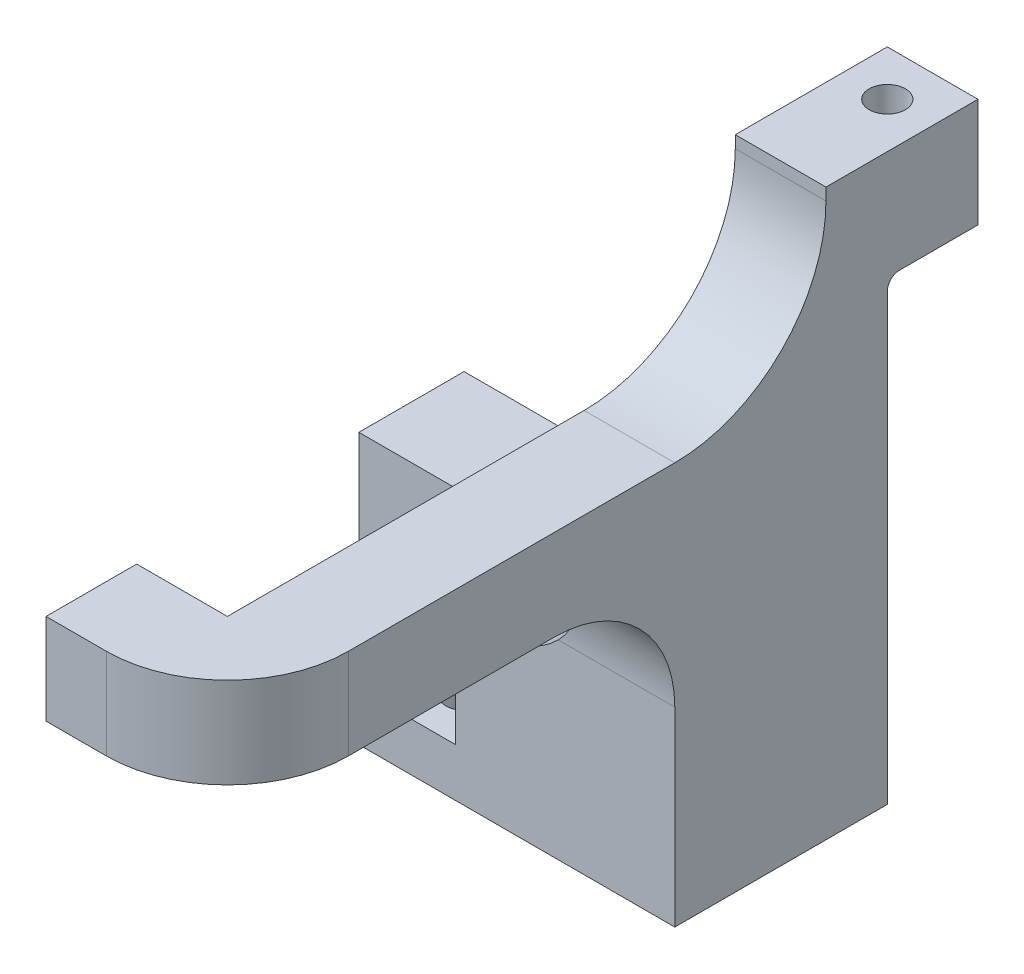
ISO-10303-21;
HEADER;
FILE_DESCRIPTION(('STEP AP214'),'2;1');
FILE_NAME('part.step','',(''),(''),'','','');
FILE_SCHEMA(('AUTOMOTIVE_DESIGN { 1 0 10303 214 1 1 1 1 }'));
ENDSEC;
DATA;
#1=APPLICATION_CONTEXT('core data for automotive mechanical design processes');
#2=APPLICATION_PROTOCOL_DEFINITION('international standard','automotive_design',2000,#1);
#3=PRODUCT_CONTEXT('',#1,'mechanical');
#4=PRODUCT('Part','Part','',(#3));
#5=PRODUCT_RELATED_PRODUCT_CATEGORY('part','',(#4));
#6=PRODUCT_DEFINITION_FORMATION('','',#4);
#7=PRODUCT_DEFINITION_CONTEXT('part definition',#1,'design');
#8=PRODUCT_DEFINITION('design','',#6,#7);
#9=PRODUCT_DEFINITION_SHAPE('','',#8);
#10=(LENGTH_UNIT() NAMED_UNIT(*) SI_UNIT(.MILLI.,.METRE.));
#11=(NAMED_UNIT(*) PLANE_ANGLE_UNIT() SI_UNIT($,.RADIAN.));
#12=(NAMED_UNIT(*) SI_UNIT($,.STERADIAN.) SOLID_ANGLE_UNIT());
#13=UNCERTAINTY_MEASURE_WITH_UNIT(LENGTH_MEASURE(1.E-05),#10,'distance_accuracy_value','');
#14=(GEOMETRIC_REPRESENTATION_CONTEXT(3) GLOBAL_UNCERTAINTY_ASSIGNED_CONTEXT((#13)) GLOBAL_UNIT_ASSIGNED_CONTEXT((#10,
#11,#12)) REPRESENTATION_CONTEXT('',''));
#15=CARTESIAN_POINT('',(0.,0.,0.));
#16=DIRECTION('',(0.,0.,1.));
#17=DIRECTION('',(1.,0.,0.));
#18=AXIS2_PLACEMENT_3D('',#15,#16,#17);
#19=CARTESIAN_POINT('',(-72.925,40.,80.1975398981366));
#20=DIRECTION('',(0.,0.,-1.));
#21=DIRECTION('',(1.,0.,0.));
#22=AXIS2_PLACEMENT_3D('',#19,#20,#21);
#23=CYLINDRICAL_SURFACE('',#22,7.5);
#24=CARTESIAN_POINT('',(-65.425,40.,64.1139777347254));
#25=CARTESIAN_POINT('',(-65.4249772438871,39.8445221092474,64.0180331681623));
#26=CARTESIAN_POINT('',(-65.4298346400299,39.686339067759,63.9263783075882));
#27=CARTESIAN_POINT('',(-65.4501528101208,39.3656502932931,63.7520680027181));
#28=CARTESIAN_POINT('',(-65.4656192459043,39.2031422967066,63.6694173911189));
#29=CARTESIAN_POINT('',(-65.5079324331207,38.8755858491255,63.513888847099));
#30=CARTESIAN_POINT('',(-65.5347425315859,38.7105472158723,63.440980425979));
#31=CARTESIAN_POINT('',(-65.600351000794,38.3788638985895,63.3049432948971));
#32=CARTESIAN_POINT('',(-65.6391467735014,38.2122195701897,63.2418124699744));
#33=CARTESIAN_POINT('',(-65.7293371098939,37.8780884322385,63.1251835039027));
#34=CARTESIAN_POINT('',(-65.7807860976065,37.710601128866,63.0717287530682));
#35=CARTESIAN_POINT('',(-65.8963667348753,37.3771281979921,62.9746965544279));
#36=CARTESIAN_POINT('',(-65.960499551139,37.2111427101033,62.9311200160502));
#37=CARTESIAN_POINT('',(-66.1013869419035,36.8822570897864,62.8535087240611));
#38=CARTESIAN_POINT('',(-66.1781460783117,36.7193580963232,62.8194774312266));
#39=CARTESIAN_POINT('',(-66.3439519124394,36.398271088903,62.7604244734835));
#40=CARTESIAN_POINT('',(-66.4329976393504,36.2400827039432,62.7354020973107));
#41=CARTESIAN_POINT('',(-66.6194094708557,35.9354901653982,62.6943723268248));
#42=CARTESIAN_POINT('',(-66.7163532082868,35.7888666331716,62.6780692012634));
#43=CARTESIAN_POINT('',(-66.9206277090854,35.5023926490622,62.6523075545515));
#44=CARTESIAN_POINT('',(-67.0279597461105,35.3625430308571,62.6428498738952));
#45=CARTESIAN_POINT('',(-67.2524721214189,35.0904630322989,62.6298685426952));
#46=CARTESIAN_POINT('',(-67.3696627813558,34.9582408879846,62.6263511947394));
#47=CARTESIAN_POINT('',(-67.6130510302732,34.7024123799341,62.6242940516118));
#48=CARTESIAN_POINT('',(-67.7392451816666,34.5788027631369,62.6257523665544));
#49=CARTESIAN_POINT('',(-67.8696144573129,34.4598666970198,62.6292097527758));
#50=B_SPLINE_CURVE_WITH_KNOTS('',3,(#24,#25,#26,#27,#28,#29,#30,#31,#32,#33,#34,#35,#36,#37,#38,
#39,#40,#41,#42,#43,#44,#45,#46,#47,#48,#49),.UNSPECIFIED.,.F.,.F.,(4,2,2,2,2,2,2,2,2,2,2,2,4),
(0.,0.548035113739717,1.09636293080322,1.64293239308,2.18938346304048,2.73822734665108,
3.28712173854301,3.83621488411844,4.38526466865447,4.91427257243661,5.44334541759769,
5.9729792478444,6.50241193184122),.UNSPECIFIED.);
#51=CARTESIAN_POINT('',(-67.5689286785929,34.75,62.625));
#52=VERTEX_POINT('',#51);
#53=CARTESIAN_POINT('',(-65.425,40.,64.1139777347254));
#54=VERTEX_POINT('',#53);
#55=EDGE_CURVE('E412',#52,#54,#50,.F.);
#56=ORIENTED_EDGE('',*,*,#55,.T.);
#57=DIRECTION('',(0.,0.,-1.));
#58=VECTOR('',#57,1.);
#59=CARTESIAN_POINT('',(-65.425,40.,80.1975398981366));
#60=LINE('',#59,#58);
#61=CARTESIAN_POINT('',(-65.425,40.,45.0524601018634));
#62=VERTEX_POINT('',#61);
#63=EDGE_CURVE('E406',#54,#62,#60,.T.);
#64=ORIENTED_EDGE('',*,*,#63,.T.);
#65=CARTESIAN_POINT('',(-72.925,40.,45.0524601018634));
#66=DIRECTION('',(0.,0.,1.));
#67=DIRECTION('',(1.,0.,0.));
#68=AXIS2_PLACEMENT_3D('',#65,#66,#67);
#69=CIRCLE('',#68,7.5);
#70=CARTESIAN_POINT('',(-72.925,32.5,45.0524601018634));
#71=VERTEX_POINT('',#70);
#72=EDGE_CURVE('E11',#71,#62,#69,.T.);
#73=ORIENTED_EDGE('',*,*,#72,.F.);
#74=DIRECTION('',(0.,0.,-1.));
#75=VECTOR('',#74,1.);
#76=CARTESIAN_POINT('',(-72.925,32.5,58.7524601018634));
#77=LINE('',#76,#75);
#78=CARTESIAN_POINT('',(-72.925,32.5,62.625));
#79=VERTEX_POINT('',#78);
#80=EDGE_CURVE('E409',#71,#79,#77,.F.);
#81=ORIENTED_EDGE('',*,*,#80,.T.);
#82=CARTESIAN_POINT('',(-72.925,40.,62.625));
#83=DIRECTION('',(0.,0.,1.));
#84=DIRECTION('',(1.,0.,0.));
#85=AXIS2_PLACEMENT_3D('',#82,#83,#84);
#86=CIRCLE('',#85,7.5);
#87=EDGE_CURVE('E45',#52,#79,#86,.F.);
#88=ORIENTED_EDGE('',*,*,#87,.F.);
#89=EDGE_LOOP('',(#56,#64,#73,#81,#88));
#90=FACE_BOUND('',#89,.T.);
#91=ADVANCED_FACE('F37',(#90),#23,.F.);
#92=CARTESIAN_POINT('',(0.,55.75,44.0524601018634));
#93=DIRECTION('',(-1.,0.,0.));
#94=DIRECTION('',(0.,0.,-1.));
#95=AXIS2_PLACEMENT_3D('',#92,#93,#94);
#96=CYLINDRICAL_SURFACE('',#95,1.);
#97=DIRECTION('',(1.,0.,0.));
#98=VECTOR('',#97,1.);
#99=CARTESIAN_POINT('',(0.,56.75,44.0524601018634));
#100=LINE('',#99,#98);
#101=CARTESIAN_POINT('',(-65.425,56.75,44.0524601018634));
#102=VERTEX_POINT('',#101);
#103=CARTESIAN_POINT('',(-57.925,56.75,44.0524601018634));
#104=VERTEX_POINT('',#103);
#105=EDGE_CURVE('E397',#102,#104,#100,.T.);
#106=ORIENTED_EDGE('',*,*,#105,.T.);
#107=CARTESIAN_POINT('',(-57.925,55.75,44.0524601018634));
#108=DIRECTION('',(1.,0.,0.));
#109=DIRECTION('',(0.,0.,-1.));
#110=AXIS2_PLACEMENT_3D('',#107,#108,#109);
#111=CIRCLE('',#110,1.);
#112=CARTESIAN_POINT('',(-57.925,55.75,45.0524601018634));
#113=VERTEX_POINT('',#112);
#114=EDGE_CURVE('E230',#113,#104,#111,.F.);
#115=ORIENTED_EDGE('',*,*,#114,.F.);
#116=DIRECTION('',(1.,0.,0.));
#117=VECTOR('',#116,1.);
#118=CARTESIAN_POINT('',(0.,55.75,45.0524601018634));
#119=LINE('',#118,#117);
#120=CARTESIAN_POINT('',(-65.425,55.75,45.0524601018634));
#121=VERTEX_POINT('',#120);
#122=EDGE_CURVE('E399',#113,#121,#119,.F.);
#123=ORIENTED_EDGE('',*,*,#122,.T.);
#124=CARTESIAN_POINT('',(-65.425,55.75,44.0524601018634));
#125=DIRECTION('',(1.,0.,0.));
#126=DIRECTION('',(0.,0.,-1.));
#127=AXIS2_PLACEMENT_3D('',#124,#125,#126);
#128=CIRCLE('',#127,1.);
#129=EDGE_CURVE('E402',#102,#121,#128,.T.);
#130=ORIENTED_EDGE('',*,*,#129,.F.);
#131=EDGE_LOOP('',(#106,#115,#123,#130));
#132=FACE_BOUND('',#131,.T.);
#133=ADVANCED_FACE('F429',(#132),#96,.F.);
#134=CARTESIAN_POINT('',(-67.925,-35.9364248901641,89.625));
#135=DIRECTION('',(0.,-1.,0.));
#136=DIRECTION('',(0.,0.,1.));
#137=AXIS2_PLACEMENT_3D('',#134,#135,#136);
#138=CYLINDRICAL_SURFACE('',#137,10.);
#139=DIRECTION('',(0.,1.,0.));
#140=VECTOR('',#139,1.);
#141=CARTESIAN_POINT('',(-57.925,-35.9364248901641,89.625));
#142=LINE('',#141,#140);
#143=CARTESIAN_POINT('',(-57.925,44.75,89.625));
#144=VERTEX_POINT('',#143);
#145=CARTESIAN_POINT('',(-57.925,52.25,89.625));
#146=VERTEX_POINT('',#145);
#147=EDGE_CURVE('E385',#144,#146,#142,.T.);
#148=ORIENTED_EDGE('',*,*,#147,.T.);
#149=CARTESIAN_POINT('',(-67.925,52.25,89.625));
#150=DIRECTION('',(0.,1.,0.));
#151=DIRECTION('',(0.,0.,1.));
#152=AXIS2_PLACEMENT_3D('',#149,#150,#151);
#153=CIRCLE('',#152,10.);
#154=CARTESIAN_POINT('',(-67.925,52.25,99.625));
#155=VERTEX_POINT('',#154);
#156=EDGE_CURVE('E394',#146,#155,#153,.F.);
#157=ORIENTED_EDGE('',*,*,#156,.T.);
#158=DIRECTION('',(0.,1.,0.));
#159=VECTOR('',#158,1.);
#160=CARTESIAN_POINT('',(-67.925,-35.9364248901641,99.625));
#161=LINE('',#160,#159);
#162=CARTESIAN_POINT('',(-67.925,44.75,99.625));
#163=VERTEX_POINT('',#162);
#164=EDGE_CURVE('E388',#155,#163,#161,.F.);
#165=ORIENTED_EDGE('',*,*,#164,.T.);
#166=CARTESIAN_POINT('',(-67.925,44.75,89.625));
#167=DIRECTION('',(0.,-1.,0.));
#168=DIRECTION('',(0.,0.,-1.));
#169=AXIS2_PLACEMENT_3D('',#166,#167,#168);
#170=CIRCLE('',#169,10.);
#171=EDGE_CURVE('E391',#163,#144,#170,.F.);
#172=ORIENTED_EDGE('',*,*,#171,.T.);
#173=EDGE_LOOP('',(#148,#157,#165,#172));
#174=FACE_BOUND('',#173,.T.);
#175=ADVANCED_FACE('F425',(#174),#138,.T.);
#176=CARTESIAN_POINT('',(0.,34.75,72.625));
#177=DIRECTION('',(-1.,0.,0.));
#178=DIRECTION('',(0.,0.,-1.));
#179=AXIS2_PLACEMENT_3D('',#176,#177,#178);
#180=CYLINDRICAL_SURFACE('',#179,10.);
#181=DIRECTION('',(1.,0.,0.));
#182=VECTOR('',#181,1.);
#183=CARTESIAN_POINT('',(0.,34.75,62.625));
#184=LINE('',#183,#182);
#185=CARTESIAN_POINT('',(-57.925,34.75,62.625));
#186=VERTEX_POINT('',#185);
#187=EDGE_CURVE('E52',#52,#186,#184,.T.);
#188=ORIENTED_EDGE('',*,*,#187,.T.);
#189=CARTESIAN_POINT('',(-57.925,34.75,72.625));
#190=DIRECTION('',(1.,0.,0.));
#191=DIRECTION('',(0.,0.,-1.));
#192=AXIS2_PLACEMENT_3D('',#189,#190,#191);
#193=CIRCLE('',#192,10.);
#194=CARTESIAN_POINT('',(-57.925,44.75,72.625));
#195=VERTEX_POINT('',#194);
#196=EDGE_CURVE('E382',#195,#186,#193,.F.);
#197=ORIENTED_EDGE('',*,*,#196,.F.);
#198=DIRECTION('',(1.,0.,0.));
#199=VECTOR('',#198,1.);
#200=CARTESIAN_POINT('',(0.,44.75,72.625));
#201=LINE('',#200,#199);
#202=CARTESIAN_POINT('',(-65.425,44.75,72.625));
#203=VERTEX_POINT('',#202);
#204=EDGE_CURVE('E376',#195,#203,#201,.F.);
#205=ORIENTED_EDGE('',*,*,#204,.T.);
#206=CARTESIAN_POINT('',(-65.425,34.75,72.625));
#207=DIRECTION('',(1.,0.,0.));
#208=DIRECTION('',(0.,0.,-1.));
#209=AXIS2_PLACEMENT_3D('',#206,#207,#208);
#210=CIRCLE('',#209,10.);
#211=EDGE_CURVE('E379',#54,#203,#210,.T.);
#212=ORIENTED_EDGE('',*,*,#211,.F.);
#213=ORIENTED_EDGE('',*,*,#55,.F.);
#214=EDGE_LOOP('',(#188,#197,#205,#212,#213));
#215=FACE_BOUND('',#214,.T.);
#216=ADVANCED_FACE('F419',(#215),#180,.F.);
#217=CARTESIAN_POINT('',(0.,0.,62.625));
#218=DIRECTION('',(0.,0.,-1.));
#219=DIRECTION('',(1.,0.,0.));
#220=AXIS2_PLACEMENT_3D('',#217,#218,#219);
#221=PLANE('',#220);
#222=ORIENTED_EDGE('',*,*,#87,.T.);
#223=DIRECTION('',(-1.,0.,0.));
#224=VECTOR('',#223,1.);
#225=CARTESIAN_POINT('',(-65.525,32.5,62.625));
#226=LINE('',#225,#224);
#227=CARTESIAN_POINT('',(-76.062179306799,32.5,62.625));
#228=VERTEX_POINT('',#227);
#229=EDGE_CURVE('E60',#79,#228,#226,.T.);
#230=ORIENTED_EDGE('',*,*,#229,.T.);
#231=DIRECTION('',(0.,1.,0.));
#232=VECTOR('',#231,1.);
#233=CARTESIAN_POINT('',(-76.062179306799,23.,62.625));
#234=LINE('',#233,#232);
#235=CARTESIAN_POINT('',(-76.062179306799,23.,62.625));
#236=VERTEX_POINT('',#235);
#237=EDGE_CURVE('E370',#228,#236,#234,.F.);
#238=ORIENTED_EDGE('',*,*,#237,.T.);
#239=DIRECTION('',(1.,0.,0.));
#240=VECTOR('',#239,1.);
#241=CARTESIAN_POINT('',(0.,23.,62.625));
#242=LINE('',#241,#240);
#243=CARTESIAN_POINT('',(-92.925,23.,62.625));
#244=VERTEX_POINT('',#243);
#245=EDGE_CURVE('E299',#244,#236,#242,.T.);
#246=ORIENTED_EDGE('',*,*,#245,.F.);
#247=DIRECTION('',(0.,-1.,0.));
#248=VECTOR('',#247,1.);
#249=CARTESIAN_POINT('',(-92.925,0.,62.625));
#250=LINE('',#249,#248);
#251=CARTESIAN_POINT('',(-92.925,19.,62.625));
#252=VERTEX_POINT('',#251);
#253=EDGE_CURVE('E302',#244,#252,#250,.T.);
#254=ORIENTED_EDGE('',*,*,#253,.T.);
#255=DIRECTION('',(1.,0.,0.));
#256=VECTOR('',#255,1.);
#257=CARTESIAN_POINT('',(-92.925,19.,62.625));
#258=LINE('',#257,#256);
#259=CARTESIAN_POINT('',(-57.925,19.,62.625));
#260=VERTEX_POINT('',#259);
#261=EDGE_CURVE('E305',#252,#260,#258,.T.);
#262=ORIENTED_EDGE('',*,*,#261,.T.);
#263=DIRECTION('',(0.,1.,0.));
#264=VECTOR('',#263,1.);
#265=CARTESIAN_POINT('',(-57.925,-35.9364248901641,62.625));
#266=LINE('',#265,#264);
#267=EDGE_CURVE('E308',#260,#186,#266,.T.);
#268=ORIENTED_EDGE('',*,*,#267,.T.);
#269=ORIENTED_EDGE('',*,*,#187,.F.);
#270=EDGE_LOOP('',(#222,#230,#238,#246,#254,#262,#268,#269));
#271=FACE_BOUND('',#270,.T.);
#272=ADVANCED_FACE('F424',(#271),#221,.F.);
#273=CARTESIAN_POINT('',(-65.425,-35.9364248901641,80.1975398981366));
#274=DIRECTION('',(-1.,0.,0.));
#275=DIRECTION('',(0.,0.,-1.));
#276=AXIS2_PLACEMENT_3D('',#273,#274,#275);
#277=PLANE('',#276);
#278=ORIENTED_EDGE('',*,*,#211,.T.);
#279=DIRECTION('',(0.,0.,-1.));
#280=VECTOR('',#279,1.);
#281=CARTESIAN_POINT('',(-65.425,44.75,92.125));
#282=LINE('',#281,#280);
#283=CARTESIAN_POINT('',(-65.425,44.75,92.125));
#284=VERTEX_POINT('',#283);
#285=EDGE_CURVE('E273',#284,#203,#282,.T.);
#286=ORIENTED_EDGE('',*,*,#285,.F.);
#287=DIRECTION('',(0.,1.,0.));
#288=VECTOR('',#287,1.);
#289=CARTESIAN_POINT('',(-65.425,0.,92.125));
#290=LINE('',#289,#288);
#291=CARTESIAN_POINT('',(-65.425,52.25,92.125));
#292=VERTEX_POINT('',#291);
#293=EDGE_CURVE('E265',#284,#292,#290,.T.);
#294=ORIENTED_EDGE('',*,*,#293,.T.);
#295=DIRECTION('',(0.,0.,-1.));
#296=VECTOR('',#295,1.);
#297=CARTESIAN_POINT('',(-65.425,52.25,92.125));
#298=LINE('',#297,#296);
#299=CARTESIAN_POINT('',(-65.425,52.25,62.625));
#300=VERTEX_POINT('',#299);
#301=EDGE_CURVE('E274',#292,#300,#298,.T.);
#302=ORIENTED_EDGE('',*,*,#301,.T.);
#303=CARTESIAN_POINT('',(-65.425,64.75,62.625));
#304=DIRECTION('',(1.,0.,0.));
#305=DIRECTION('',(0.,0.,-1.));
#306=AXIS2_PLACEMENT_3D('',#303,#304,#305);
#307=CIRCLE('',#306,12.5);
#308=CARTESIAN_POINT('',(-65.425,64.75,50.125));
#309=VERTEX_POINT('',#308);
#310=EDGE_CURVE('E360',#309,#300,#307,.F.);
#311=ORIENTED_EDGE('',*,*,#310,.F.);
#312=DIRECTION('',(0.,-1.,0.));
#313=VECTOR('',#312,1.);
#314=CARTESIAN_POINT('',(-65.425,65.75,50.125));
#315=LINE('',#314,#313);
#316=CARTESIAN_POINT('',(-65.425,65.75,50.125));
#317=VERTEX_POINT('',#316);
#318=EDGE_CURVE('E247',#317,#309,#315,.T.);
#319=ORIENTED_EDGE('',*,*,#318,.F.);
#320=DIRECTION('',(0.,0.,-1.));
#321=VECTOR('',#320,1.);
#322=CARTESIAN_POINT('',(-65.425,65.75,125.25));
#323=LINE('',#322,#321);
#324=CARTESIAN_POINT('',(-65.425,65.75,37.5524601018634));
#325=VERTEX_POINT('',#324);
#326=EDGE_CURVE('E244',#317,#325,#323,.T.);
#327=ORIENTED_EDGE('',*,*,#326,.T.);
#328=DIRECTION('',(0.,1.,0.));
#329=VECTOR('',#328,1.);
#330=CARTESIAN_POINT('',(-65.425,58.75,37.5524601018634));
#331=LINE('',#330,#329);
#332=CARTESIAN_POINT('',(-65.425,56.75,37.5524601018634));
#333=VERTEX_POINT('',#332);
#334=EDGE_CURVE('E226',#333,#325,#331,.T.);
#335=ORIENTED_EDGE('',*,*,#334,.F.);
#336=DIRECTION('',(0.,0.,1.));
#337=VECTOR('',#336,1.);
#338=CARTESIAN_POINT('',(-65.425,56.75,37.5524601018634));
#339=LINE('',#338,#337);
#340=EDGE_CURVE('E212',#333,#102,#339,.T.);
#341=ORIENTED_EDGE('',*,*,#340,.T.);
#342=ORIENTED_EDGE('',*,*,#129,.T.);
#343=DIRECTION('',(0.,1.,0.));
#344=VECTOR('',#343,1.);
#345=CARTESIAN_POINT('',(-65.425,-35.9364248901641,45.0524601018634));
#346=LINE('',#345,#344);
#347=EDGE_CURVE('E363',#62,#121,#346,.T.);
#348=ORIENTED_EDGE('',*,*,#347,.F.);
#349=ORIENTED_EDGE('',*,*,#63,.F.);
#350=EDGE_LOOP('',(#278,#286,#294,#302,#311,#319,#327,#335,#341,#342,#348,#349));
#351=FACE_BOUND('',#350,.T.);
#352=ADVANCED_FACE('F440',(#351),#277,.T.);
#353=CARTESIAN_POINT('',(-65.425,-35.9364248901641,45.0524601018634));
#354=DIRECTION('',(0.,0.,-1.));
#355=DIRECTION('',(1.,0.,0.));
#356=AXIS2_PLACEMENT_3D('',#353,#354,#355);
#357=PLANE('',#356);
#358=DIRECTION('',(0.,1.,0.));
#359=VECTOR('',#358,1.);
#360=CARTESIAN_POINT('',(-57.925,-35.9364248901641,45.0524601018634));
#361=LINE('',#360,#359);
#362=CARTESIAN_POINT('',(-57.925,19.,45.0524601018634));
#363=VERTEX_POINT('',#362);
#364=EDGE_CURVE('E364',#363,#113,#361,.T.);
#365=ORIENTED_EDGE('',*,*,#364,.F.);
#366=DIRECTION('',(1.,0.,0.));
#367=VECTOR('',#366,1.);
#368=CARTESIAN_POINT('',(-92.925,19.,45.0524601018634));
#369=LINE('',#368,#367);
#370=CARTESIAN_POINT('',(-92.925,19.,45.0524601018634));
#371=VERTEX_POINT('',#370);
#372=EDGE_CURVE('E353',#371,#363,#369,.T.);
#373=ORIENTED_EDGE('',*,*,#372,.F.);
#374=DIRECTION('',(0.,1.,0.));
#375=VECTOR('',#374,1.);
#376=CARTESIAN_POINT('',(-92.925,0.,45.0524601018634));
#377=LINE('',#376,#375);
#378=CARTESIAN_POINT('',(-92.925,32.5,45.0524601018634));
#379=VERTEX_POINT('',#378);
#380=EDGE_CURVE('E348',#371,#379,#377,.T.);
#381=ORIENTED_EDGE('',*,*,#380,.T.);
#382=DIRECTION('',(1.,0.,0.));
#383=VECTOR('',#382,1.);
#384=CARTESIAN_POINT('',(-92.925,32.5,45.0524601018634));
#385=LINE('',#384,#383);
#386=CARTESIAN_POINT('',(-84.225,32.5,45.0524601018634));
#387=VERTEX_POINT('',#386);
#388=EDGE_CURVE('E284',#379,#387,#385,.T.);
#389=ORIENTED_EDGE('',*,*,#388,.T.);
#390=DIRECTION('',(0.,1.,0.));
#391=VECTOR('',#390,1.);
#392=CARTESIAN_POINT('',(-84.225,23.,45.0524601018634));
#393=LINE('',#392,#391);
#394=CARTESIAN_POINT('',(-84.225,23.,45.0524601018634));
#395=VERTEX_POINT('',#394);
#396=EDGE_CURVE('E338',#395,#387,#393,.T.);
#397=ORIENTED_EDGE('',*,*,#396,.F.);
#398=DIRECTION('',(1.,0.,0.));
#399=VECTOR('',#398,1.);
#400=CARTESIAN_POINT('',(0.,23.,45.0524601018634));
#401=LINE('',#400,#399);
#402=CARTESIAN_POINT('',(-74.225,23.,45.0524601018634));
#403=VERTEX_POINT('',#402);
#404=EDGE_CURVE('E325',#395,#403,#401,.T.);
#405=ORIENTED_EDGE('',*,*,#404,.T.);
#406=DIRECTION('',(0.,1.,0.));
#407=VECTOR('',#406,1.);
#408=CARTESIAN_POINT('',(-74.225,23.,45.0524601018634));
#409=LINE('',#408,#407);
#410=CARTESIAN_POINT('',(-74.225,32.5,45.0524601018634));
#411=VERTEX_POINT('',#410);
#412=EDGE_CURVE('E335',#403,#411,#409,.T.);
#413=ORIENTED_EDGE('',*,*,#412,.T.);
#414=DIRECTION('',(1.,0.,0.));
#415=VECTOR('',#414,1.);
#416=CARTESIAN_POINT('',(-74.225,32.5,45.0524601018634));
#417=LINE('',#416,#415);
#418=EDGE_CURVE('E296',#411,#71,#417,.T.);
#419=ORIENTED_EDGE('',*,*,#418,.T.);
#420=ORIENTED_EDGE('',*,*,#72,.T.);
#421=ORIENTED_EDGE('',*,*,#347,.T.);
#422=ORIENTED_EDGE('',*,*,#122,.F.);
#423=EDGE_LOOP('',(#365,#373,#381,#389,#397,#405,#413,#419,#420,#421,#422));
#424=FACE_BOUND('',#423,.T.);
#425=ADVANCED_FACE('F479',(#424),#357,.T.);
#426=CARTESIAN_POINT('',(-70.425,64.75,62.625));
#427=DIRECTION('',(1.,0.,0.));
#428=DIRECTION('',(0.,0.,1.));
#429=AXIS2_PLACEMENT_3D('',#426,#427,#428);
#430=CYLINDRICAL_SURFACE('',#429,12.5);
#431=DIRECTION('',(1.,0.,0.));
#432=VECTOR('',#431,1.);
#433=CARTESIAN_POINT('',(-70.425,52.25,62.625));
#434=LINE('',#433,#432);
#435=CARTESIAN_POINT('',(-57.925,52.25,62.625));
#436=VERTEX_POINT('',#435);
#437=EDGE_CURVE('E310',#300,#436,#434,.T.);
#438=ORIENTED_EDGE('',*,*,#437,.T.);
#439=CARTESIAN_POINT('',(-57.925,64.75,62.625));
#440=DIRECTION('',(1.,0.,0.));
#441=DIRECTION('',(0.,0.,-1.));
#442=AXIS2_PLACEMENT_3D('',#439,#440,#441);
#443=CIRCLE('',#442,12.5);
#444=CARTESIAN_POINT('',(-57.925,64.75,50.125));
#445=VERTEX_POINT('',#444);
#446=EDGE_CURVE('E357',#436,#445,#443,.T.);
#447=ORIENTED_EDGE('',*,*,#446,.T.);
#448=DIRECTION('',(1.,0.,0.));
#449=VECTOR('',#448,1.);
#450=CARTESIAN_POINT('',(-70.425,64.75,50.125));
#451=LINE('',#450,#449);
#452=EDGE_CURVE('E366',#309,#445,#451,.T.);
#453=ORIENTED_EDGE('',*,*,#452,.F.);
#454=ORIENTED_EDGE('',*,*,#310,.T.);
#455=EDGE_LOOP('',(#438,#447,#453,#454));
#456=FACE_BOUND('',#455,.T.);
#457=ADVANCED_FACE('F452',(#456),#430,.F.);
#458=CARTESIAN_POINT('',(-57.925,-35.9364248901641,80.1975398981366));
#459=DIRECTION('',(-1.,0.,0.));
#460=DIRECTION('',(0.,0.,-1.));
#461=AXIS2_PLACEMENT_3D('',#458,#459,#460);
#462=PLANE('',#461);
#463=DIRECTION('',(0.,0.,-1.));
#464=VECTOR('',#463,1.);
#465=CARTESIAN_POINT('',(-57.925,44.75,92.125));
#466=LINE('',#465,#464);
#467=EDGE_CURVE('E280',#144,#195,#466,.T.);
#468=ORIENTED_EDGE('',*,*,#467,.T.);
#469=ORIENTED_EDGE('',*,*,#196,.T.);
#470=ORIENTED_EDGE('',*,*,#267,.F.);
#471=DIRECTION('',(0.,0.,-1.));
#472=VECTOR('',#471,1.);
#473=CARTESIAN_POINT('',(-57.925,19.,125.25));
#474=LINE('',#473,#472);
#475=EDGE_CURVE('E225',#260,#363,#474,.T.);
#476=ORIENTED_EDGE('',*,*,#475,.T.);
#477=ORIENTED_EDGE('',*,*,#364,.T.);
#478=ORIENTED_EDGE('',*,*,#114,.T.);
#479=DIRECTION('',(0.,0.,-1.));
#480=VECTOR('',#479,1.);
#481=CARTESIAN_POINT('',(-57.925,56.75,37.5524601018634));
#482=LINE('',#481,#480);
#483=CARTESIAN_POINT('',(-57.925,56.75,37.5524601018634));
#484=VERTEX_POINT('',#483);
#485=EDGE_CURVE('E210',#104,#484,#482,.T.);
#486=ORIENTED_EDGE('',*,*,#485,.T.);
#487=DIRECTION('',(0.,1.,0.));
#488=VECTOR('',#487,1.);
#489=CARTESIAN_POINT('',(-57.925,58.75,37.5524601018634));
#490=LINE('',#489,#488);
#491=CARTESIAN_POINT('',(-57.925,65.75,37.5524601018634));
#492=VERTEX_POINT('',#491);
#493=EDGE_CURVE('E219',#484,#492,#490,.T.);
#494=ORIENTED_EDGE('',*,*,#493,.T.);
#495=DIRECTION('',(0.,0.,1.));
#496=VECTOR('',#495,1.);
#497=CARTESIAN_POINT('',(-57.925,65.75,125.25));
#498=LINE('',#497,#496);
#499=CARTESIAN_POINT('',(-57.925,65.75,50.125));
#500=VERTEX_POINT('',#499);
#501=EDGE_CURVE('E240',#492,#500,#498,.T.);
#502=ORIENTED_EDGE('',*,*,#501,.T.);
#503=DIRECTION('',(0.,-1.,0.));
#504=VECTOR('',#503,1.);
#505=CARTESIAN_POINT('',(-57.925,65.75,50.125));
#506=LINE('',#505,#504);
#507=EDGE_CURVE('E250',#500,#445,#506,.T.);
#508=ORIENTED_EDGE('',*,*,#507,.T.);
#509=ORIENTED_EDGE('',*,*,#446,.F.);
#510=DIRECTION('',(0.,0.,-1.));
#511=VECTOR('',#510,1.);
#512=CARTESIAN_POINT('',(-57.925,52.25,92.125));
#513=LINE('',#512,#511);
#514=EDGE_CURVE('E278',#146,#436,#513,.T.);
#515=ORIENTED_EDGE('',*,*,#514,.F.);
#516=ORIENTED_EDGE('',*,*,#147,.F.);
#517=EDGE_LOOP('',(#468,#469,#470,#476,#477,#478,#486,#494,#502,#508,#509,#515,#516));
#518=FACE_BOUND('',#517,.T.);
#519=ADVANCED_FACE('F228',(#518),#462,.F.);
#520=CARTESIAN_POINT('',(-92.925,19.,125.25));
#521=DIRECTION('',(0.,1.,0.));
#522=DIRECTION('',(0.,0.,-1.));
#523=AXIS2_PLACEMENT_3D('',#520,#521,#522);
#524=PLANE('',#523);
#525=CARTESIAN_POINT('',(-79.225,19.,58.7524601018634));
#526=DIRECTION('',(0.,-1.,0.));
#527=DIRECTION('',(0.,0.,-1.));
#528=AXIS2_PLACEMENT_3D('',#525,#526,#527);
#529=CIRCLE('',#528,1.5);
#530=CARTESIAN_POINT('',(-79.225,19.,57.2524601018634));
#531=VERTEX_POINT('',#530);
#532=EDGE_CURVE('E313',#531,#531,#529,.T.);
#533=ORIENTED_EDGE('',*,*,#532,.F.);
#534=EDGE_LOOP('',(#533));
#535=FACE_BOUND('',#534,.T.);
#536=DIRECTION('',(0.,0.,-1.));
#537=VECTOR('',#536,1.);
#538=CARTESIAN_POINT('',(-92.925,19.,125.25));
#539=LINE('',#538,#537);
#540=EDGE_CURVE('E351',#252,#371,#539,.T.);
#541=ORIENTED_EDGE('',*,*,#540,.T.);
#542=ORIENTED_EDGE('',*,*,#372,.T.);
#543=ORIENTED_EDGE('',*,*,#475,.F.);
#544=ORIENTED_EDGE('',*,*,#261,.F.);
#545=EDGE_LOOP('',(#541,#542,#543,#544));
#546=FACE_BOUND('',#545,.T.);
#547=ADVANCED_FACE('F474',(#535,#546),#524,.F.);
#548=CARTESIAN_POINT('',(-92.925,0.,125.25));
#549=DIRECTION('',(1.,0.,0.));
#550=DIRECTION('',(0.,0.,1.));
#551=AXIS2_PLACEMENT_3D('',#548,#549,#550);
#552=PLANE('',#551);
#553=DIRECTION('',(0.,0.,-1.));
#554=VECTOR('',#553,1.);
#555=CARTESIAN_POINT('',(-92.925,23.,125.25));
#556=LINE('',#555,#554);
#557=CARTESIAN_POINT('',(-92.925,23.,53.7524601018634));
#558=VERTEX_POINT('',#557);
#559=EDGE_CURVE('E317',#244,#558,#556,.T.);
#560=ORIENTED_EDGE('',*,*,#559,.T.);
#561=DIRECTION('',(0.,1.,0.));
#562=VECTOR('',#561,1.);
#563=CARTESIAN_POINT('',(-92.925,23.,53.7524601018634));
#564=LINE('',#563,#562);
#565=CARTESIAN_POINT('',(-92.925,32.5,53.7524601018634));
#566=VERTEX_POINT('',#565);
#567=EDGE_CURVE('E331',#558,#566,#564,.T.);
#568=ORIENTED_EDGE('',*,*,#567,.T.);
#569=DIRECTION('',(0.,0.,-1.));
#570=VECTOR('',#569,1.);
#571=CARTESIAN_POINT('',(-92.925,32.5,45.0524601018634));
#572=LINE('',#571,#570);
#573=EDGE_CURVE('E277',#566,#379,#572,.T.);
#574=ORIENTED_EDGE('',*,*,#573,.T.);
#575=ORIENTED_EDGE('',*,*,#380,.F.);
#576=ORIENTED_EDGE('',*,*,#540,.F.);
#577=ORIENTED_EDGE('',*,*,#253,.F.);
#578=EDGE_LOOP('',(#560,#568,#574,#575,#576,#577));
#579=FACE_BOUND('',#578,.T.);
#580=ADVANCED_FACE('F542',(#579),#552,.F.);
#581=CARTESIAN_POINT('',(0.,58.75,37.5524601018634));
#582=DIRECTION('',(0.,0.,1.));
#583=DIRECTION('',(-1.,0.,0.));
#584=AXIS2_PLACEMENT_3D('',#581,#582,#583);
#585=PLANE('',#584);
#586=ORIENTED_EDGE('',*,*,#493,.F.);
#587=DIRECTION('',(-1.,0.,0.));
#588=VECTOR('',#587,1.);
#589=CARTESIAN_POINT('',(-65.425,56.75,37.5524601018634));
#590=LINE('',#589,#588);
#591=EDGE_CURVE('E204',#484,#333,#590,.T.);
#592=ORIENTED_EDGE('',*,*,#591,.T.);
#593=ORIENTED_EDGE('',*,*,#334,.T.);
#594=DIRECTION('',(1.,0.,0.));
#595=VECTOR('',#594,1.);
#596=CARTESIAN_POINT('',(0.,65.75,37.5524601018634));
#597=LINE('',#596,#595);
#598=EDGE_CURVE('E221',#325,#492,#597,.T.);
#599=ORIENTED_EDGE('',*,*,#598,.T.);
#600=EDGE_LOOP('',(#586,#592,#593,#599));
#601=FACE_BOUND('',#600,.T.);
#602=ADVANCED_FACE('F220',(#601),#585,.F.);
#603=CARTESIAN_POINT('',(-61.675,58.75,41.3024601018634));
#604=DIRECTION('',(0.,1.,0.));
#605=DIRECTION('',(0.,0.,-1.));
#606=AXIS2_PLACEMENT_3D('',#603,#604,#605);
#607=CYLINDRICAL_SURFACE('',#606,1.5);
#608=CARTESIAN_POINT('',(-61.675,65.75,41.3024601018634));
#609=DIRECTION('',(0.,-1.,0.));
#610=DIRECTION('',(0.,0.,-1.));
#611=AXIS2_PLACEMENT_3D('',#608,#609,#610);
#612=CIRCLE('',#611,1.5);
#613=CARTESIAN_POINT('',(-61.675,65.75,39.8024601018634));
#614=VERTEX_POINT('',#613);
#615=EDGE_CURVE('E216',#614,#614,#612,.F.);
#616=ORIENTED_EDGE('',*,*,#615,.T.);
#617=EDGE_LOOP('',(#616));
#618=FACE_BOUND('',#617,.T.);
#619=CARTESIAN_POINT('',(-61.675,56.75,41.3024601018634));
#620=DIRECTION('',(0.,1.,0.));
#621=DIRECTION('',(0.,0.,1.));
#622=AXIS2_PLACEMENT_3D('',#619,#620,#621);
#623=CIRCLE('',#622,1.5);
#624=CARTESIAN_POINT('',(-61.675,56.75,42.8024601018634));
#625=VERTEX_POINT('',#624);
#626=EDGE_CURVE('E233',#625,#625,#623,.T.);
#627=ORIENTED_EDGE('',*,*,#626,.F.);
#628=EDGE_LOOP('',(#627));
#629=FACE_BOUND('',#628,.T.);
#630=ADVANCED_FACE('F529',(#618,#629),#607,.F.);
#631=CARTESIAN_POINT('',(-74.225,23.,125.25));
#632=DIRECTION('',(1.,0.,0.));
#633=DIRECTION('',(0.,0.,1.));
#634=AXIS2_PLACEMENT_3D('',#631,#632,#633);
#635=PLANE('',#634);
#636=ORIENTED_EDGE('',*,*,#412,.F.);
#637=DIRECTION('',(0.,0.,1.));
#638=VECTOR('',#637,1.);
#639=CARTESIAN_POINT('',(-74.225,23.,125.25));
#640=LINE('',#639,#638);
#641=CARTESIAN_POINT('',(-74.225,23.,58.7524601018634));
#642=VERTEX_POINT('',#641);
#643=EDGE_CURVE('E328',#403,#642,#640,.T.);
#644=ORIENTED_EDGE('',*,*,#643,.T.);
#645=DIRECTION('',(0.,1.,0.));
#646=VECTOR('',#645,1.);
#647=CARTESIAN_POINT('',(-74.225,23.,58.7524601018634));
#648=LINE('',#647,#646);
#649=CARTESIAN_POINT('',(-74.225,32.5,58.7524601018634));
#650=VERTEX_POINT('',#649);
#651=EDGE_CURVE('E332',#642,#650,#648,.T.);
#652=ORIENTED_EDGE('',*,*,#651,.T.);
#653=DIRECTION('',(0.,0.,-1.));
#654=VECTOR('',#653,1.);
#655=CARTESIAN_POINT('',(-74.225,32.5,58.7524601018634));
#656=LINE('',#655,#654);
#657=EDGE_CURVE('E294',#650,#411,#656,.T.);
#658=ORIENTED_EDGE('',*,*,#657,.T.);
#659=EDGE_LOOP('',(#636,#644,#652,#658));
#660=FACE_BOUND('',#659,.T.);
#661=ADVANCED_FACE('F525',(#660),#635,.F.);
#662=CARTESIAN_POINT('',(-84.225,23.,125.25));
#663=DIRECTION('',(-1.,0.,0.));
#664=DIRECTION('',(0.,0.,-1.));
#665=AXIS2_PLACEMENT_3D('',#662,#663,#664);
#666=PLANE('',#665);
#667=DIRECTION('',(0.,1.,0.));
#668=VECTOR('',#667,1.);
#669=CARTESIAN_POINT('',(-84.225,23.,53.7524601018634));
#670=LINE('',#669,#668);
#671=CARTESIAN_POINT('',(-84.225,23.,53.7524601018634));
#672=VERTEX_POINT('',#671);
#673=CARTESIAN_POINT('',(-84.225,32.5,53.7524601018634));
#674=VERTEX_POINT('',#673);
#675=EDGE_CURVE('E341',#672,#674,#670,.T.);
#676=ORIENTED_EDGE('',*,*,#675,.F.);
#677=DIRECTION('',(0.,0.,-1.));
#678=VECTOR('',#677,1.);
#679=CARTESIAN_POINT('',(-84.225,23.,125.25));
#680=LINE('',#679,#678);
#681=EDGE_CURVE('E323',#672,#395,#680,.T.);
#682=ORIENTED_EDGE('',*,*,#681,.T.);
#683=ORIENTED_EDGE('',*,*,#396,.T.);
#684=DIRECTION('',(0.,0.,1.));
#685=VECTOR('',#684,1.);
#686=CARTESIAN_POINT('',(-84.225,32.5,45.0524601018634));
#687=LINE('',#686,#685);
#688=EDGE_CURVE('E287',#387,#674,#687,.T.);
#689=ORIENTED_EDGE('',*,*,#688,.T.);
#690=EDGE_LOOP('',(#676,#682,#683,#689));
#691=FACE_BOUND('',#690,.T.);
#692=ADVANCED_FACE('F528',(#691),#666,.F.);
#693=CARTESIAN_POINT('',(0.,23.,53.7524601018634));
#694=DIRECTION('',(0.,0.,-1.));
#695=DIRECTION('',(1.,0.,0.));
#696=AXIS2_PLACEMENT_3D('',#693,#694,#695);
#697=PLANE('',#696);
#698=ORIENTED_EDGE('',*,*,#567,.F.);
#699=DIRECTION('',(1.,0.,0.));
#700=VECTOR('',#699,1.);
#701=CARTESIAN_POINT('',(0.,23.,53.7524601018634));
#702=LINE('',#701,#700);
#703=EDGE_CURVE('E320',#558,#672,#702,.T.);
#704=ORIENTED_EDGE('',*,*,#703,.T.);
#705=ORIENTED_EDGE('',*,*,#675,.T.);
#706=DIRECTION('',(-1.,0.,0.));
#707=VECTOR('',#706,1.);
#708=CARTESIAN_POINT('',(-92.925,32.5,53.7524601018634));
#709=LINE('',#708,#707);
#710=EDGE_CURVE('E290',#674,#566,#709,.T.);
#711=ORIENTED_EDGE('',*,*,#710,.T.);
#712=EDGE_LOOP('',(#698,#704,#705,#711));
#713=FACE_BOUND('',#712,.T.);
#714=ADVANCED_FACE('F523',(#713),#697,.F.);
#715=CARTESIAN_POINT('',(0.,23.,125.25));
#716=DIRECTION('',(0.,1.,0.));
#717=DIRECTION('',(0.,0.,-1.));
#718=AXIS2_PLACEMENT_3D('',#715,#716,#717);
#719=PLANE('',#718);
#720=ORIENTED_EDGE('',*,*,#245,.T.);
#721=CARTESIAN_POINT('',(-79.225,23.,58.7524601018634));
#722=DIRECTION('',(0.,-1.,0.));
#723=DIRECTION('',(0.,0.,-1.));
#724=AXIS2_PLACEMENT_3D('',#721,#722,#723);
#725=CIRCLE('',#724,5.00000000000001);
#726=EDGE_CURVE('E321',#642,#236,#725,.T.);
#727=ORIENTED_EDGE('',*,*,#726,.F.);
#728=ORIENTED_EDGE('',*,*,#643,.F.);
#729=ORIENTED_EDGE('',*,*,#404,.F.);
#730=ORIENTED_EDGE('',*,*,#681,.F.);
#731=ORIENTED_EDGE('',*,*,#703,.F.);
#732=ORIENTED_EDGE('',*,*,#559,.F.);
#733=EDGE_LOOP('',(#720,#727,#728,#729,#730,#731,#732));
#734=FACE_BOUND('',#733,.T.);
#735=CARTESIAN_POINT('',(-79.225,23.,58.7524601018634));
#736=DIRECTION('',(0.,-1.,0.));
#737=DIRECTION('',(0.,0.,-1.));
#738=AXIS2_PLACEMENT_3D('',#735,#736,#737);
#739=CIRCLE('',#738,1.5);
#740=CARTESIAN_POINT('',(-79.225,23.,57.2524601018634));
#741=VERTEX_POINT('',#740);
#742=EDGE_CURVE('E316',#741,#741,#739,.T.);
#743=ORIENTED_EDGE('',*,*,#742,.T.);
#744=EDGE_LOOP('',(#743));
#745=FACE_BOUND('',#744,.T.);
#746=ADVANCED_FACE('F520',(#734,#745),#719,.T.);
#747=CARTESIAN_POINT('',(-79.225,23.,58.7524601018634));
#748=DIRECTION('',(0.,1.,0.));
#749=DIRECTION('',(0.,0.,-1.));
#750=AXIS2_PLACEMENT_3D('',#747,#748,#749);
#751=CYLINDRICAL_SURFACE('',#750,5.00000000000001);
#752=ORIENTED_EDGE('',*,*,#651,.F.);
#753=ORIENTED_EDGE('',*,*,#726,.T.);
#754=ORIENTED_EDGE('',*,*,#237,.F.);
#755=CARTESIAN_POINT('',(-79.225,32.5,58.7524601018634));
#756=DIRECTION('',(0.,1.,0.));
#757=DIRECTION('',(0.,0.,1.));
#758=AXIS2_PLACEMENT_3D('',#755,#756,#757);
#759=CIRCLE('',#758,4.99999999999998);
#760=EDGE_CURVE('E292',#228,#650,#759,.T.);
#761=ORIENTED_EDGE('',*,*,#760,.T.);
#762=EDGE_LOOP('',(#752,#753,#754,#761));
#763=FACE_BOUND('',#762,.T.);
#764=ADVANCED_FACE('F518',(#763),#751,.F.);
#765=CARTESIAN_POINT('',(-79.225,19.,58.7524601018634));
#766=DIRECTION('',(0.,1.,0.));
#767=DIRECTION('',(0.,0.,-1.));
#768=AXIS2_PLACEMENT_3D('',#765,#766,#767);
#769=CYLINDRICAL_SURFACE('',#768,1.5);
#770=ORIENTED_EDGE('',*,*,#742,.F.);
#771=EDGE_LOOP('',(#770));
#772=FACE_BOUND('',#771,.T.);
#773=ORIENTED_EDGE('',*,*,#532,.T.);
#774=EDGE_LOOP('',(#773));
#775=FACE_BOUND('',#774,.T.);
#776=ADVANCED_FACE('F513',(#772,#775),#769,.F.);
#777=CARTESIAN_POINT('',(-79.225,32.5,58.7524601018634));
#778=DIRECTION('',(0.,-1.,0.));
#779=DIRECTION('',(0.,0.,1.));
#780=AXIS2_PLACEMENT_3D('',#777,#778,#779);
#781=PLANE('',#780);
#782=ORIENTED_EDGE('',*,*,#418,.F.);
#783=ORIENTED_EDGE('',*,*,#657,.F.);
#784=ORIENTED_EDGE('',*,*,#760,.F.);
#785=ORIENTED_EDGE('',*,*,#229,.F.);
#786=ORIENTED_EDGE('',*,*,#80,.F.);
#787=EDGE_LOOP('',(#782,#783,#784,#785,#786));
#788=FACE_BOUND('',#787,.T.);
#789=ADVANCED_FACE('F509',(#788),#781,.F.);
#790=CARTESIAN_POINT('',(0.,32.5,125.25));
#791=DIRECTION('',(0.,-1.,0.));
#792=DIRECTION('',(0.,0.,1.));
#793=AXIS2_PLACEMENT_3D('',#790,#791,#792);
#794=PLANE('',#793);
#795=ORIENTED_EDGE('',*,*,#573,.F.);
#796=ORIENTED_EDGE('',*,*,#710,.F.);
#797=ORIENTED_EDGE('',*,*,#688,.F.);
#798=ORIENTED_EDGE('',*,*,#388,.F.);
#799=EDGE_LOOP('',(#795,#796,#797,#798));
#800=FACE_BOUND('',#799,.T.);
#801=ADVANCED_FACE('F504',(#800),#794,.F.);
#802=CARTESIAN_POINT('',(0.,52.25,92.125));
#803=DIRECTION('',(0.,-1.,0.));
#804=DIRECTION('',(0.,0.,1.));
#805=AXIS2_PLACEMENT_3D('',#802,#803,#804);
#806=PLANE('',#805);
#807=ORIENTED_EDGE('',*,*,#514,.T.);
#808=ORIENTED_EDGE('',*,*,#437,.F.);
#809=ORIENTED_EDGE('',*,*,#301,.F.);
#810=DIRECTION('',(1.,0.,0.));
#811=VECTOR('',#810,1.);
#812=CARTESIAN_POINT('',(-72.925,52.25,92.125));
#813=LINE('',#812,#811);
#814=CARTESIAN_POINT('',(-72.925,52.25,92.125));
#815=VERTEX_POINT('',#814);
#816=EDGE_CURVE('E263',#815,#292,#813,.T.);
#817=ORIENTED_EDGE('',*,*,#816,.F.);
#818=DIRECTION('',(0.,0.,-1.));
#819=VECTOR('',#818,1.);
#820=CARTESIAN_POINT('',(-72.925,52.25,92.125));
#821=LINE('',#820,#819);
#822=CARTESIAN_POINT('',(-72.925,52.25,99.625));
#823=VERTEX_POINT('',#822);
#824=EDGE_CURVE('E259',#823,#815,#821,.T.);
#825=ORIENTED_EDGE('',*,*,#824,.F.);
#826=DIRECTION('',(1.,0.,0.));
#827=VECTOR('',#826,1.);
#828=CARTESIAN_POINT('',(-72.925,52.25,99.625));
#829=LINE('',#828,#827);
#830=EDGE_CURVE('E266',#823,#155,#829,.T.);
#831=ORIENTED_EDGE('',*,*,#830,.T.);
#832=ORIENTED_EDGE('',*,*,#156,.F.);
#833=EDGE_LOOP('',(#807,#808,#809,#817,#825,#831,#832));
#834=FACE_BOUND('',#833,.T.);
#835=ADVANCED_FACE('F455',(#834),#806,.F.);
#836=CARTESIAN_POINT('',(0.,44.75,92.125));
#837=DIRECTION('',(0.,1.,0.));
#838=DIRECTION('',(0.,0.,-1.));
#839=AXIS2_PLACEMENT_3D('',#836,#837,#838);
#840=PLANE('',#839);
#841=DIRECTION('',(1.,0.,0.));
#842=VECTOR('',#841,1.);
#843=CARTESIAN_POINT('',(-72.925,44.75,99.625));
#844=LINE('',#843,#842);
#845=CARTESIAN_POINT('',(-72.925,44.75,99.625));
#846=VERTEX_POINT('',#845);
#847=EDGE_CURVE('E268',#846,#163,#844,.T.);
#848=ORIENTED_EDGE('',*,*,#847,.F.);
#849=DIRECTION('',(0.,0.,1.));
#850=VECTOR('',#849,1.);
#851=CARTESIAN_POINT('',(-72.925,44.75,92.125));
#852=LINE('',#851,#850);
#853=CARTESIAN_POINT('',(-72.925,44.75,92.125));
#854=VERTEX_POINT('',#853);
#855=EDGE_CURVE('E254',#854,#846,#852,.T.);
#856=ORIENTED_EDGE('',*,*,#855,.F.);
#857=DIRECTION('',(1.,0.,0.));
#858=VECTOR('',#857,1.);
#859=CARTESIAN_POINT('',(-72.925,44.75,92.125));
#860=LINE('',#859,#858);
#861=EDGE_CURVE('E262',#854,#284,#860,.T.);
#862=ORIENTED_EDGE('',*,*,#861,.T.);
#863=ORIENTED_EDGE('',*,*,#285,.T.);
#864=ORIENTED_EDGE('',*,*,#204,.F.);
#865=ORIENTED_EDGE('',*,*,#467,.F.);
#866=ORIENTED_EDGE('',*,*,#171,.F.);
#867=EDGE_LOOP('',(#848,#856,#862,#863,#864,#865,#866));
#868=FACE_BOUND('',#867,.T.);
#869=ADVANCED_FACE('F464',(#868),#840,.F.);
#870=CARTESIAN_POINT('',(-72.925,44.75,92.125));
#871=DIRECTION('',(0.,0.,-1.));
#872=DIRECTION('',(1.,0.,0.));
#873=AXIS2_PLACEMENT_3D('',#870,#871,#872);
#874=PLANE('',#873);
#875=ORIENTED_EDGE('',*,*,#861,.F.);
#876=DIRECTION('',(0.,-1.,0.));
#877=VECTOR('',#876,1.);
#878=CARTESIAN_POINT('',(-72.925,44.75,92.125));
#879=LINE('',#878,#877);
#880=EDGE_CURVE('E252',#815,#854,#879,.T.);
#881=ORIENTED_EDGE('',*,*,#880,.F.);
#882=ORIENTED_EDGE('',*,*,#816,.T.);
#883=ORIENTED_EDGE('',*,*,#293,.F.);
#884=EDGE_LOOP('',(#875,#881,#882,#883));
#885=FACE_BOUND('',#884,.T.);
#886=ADVANCED_FACE('F485',(#885),#874,.T.);
#887=CARTESIAN_POINT('',(-72.925,44.75,99.625));
#888=DIRECTION('',(0.,0.,1.));
#889=DIRECTION('',(-1.,0.,0.));
#890=AXIS2_PLACEMENT_3D('',#887,#888,#889);
#891=PLANE('',#890);
#892=ORIENTED_EDGE('',*,*,#830,.F.);
#893=DIRECTION('',(0.,1.,0.));
#894=VECTOR('',#893,1.);
#895=CARTESIAN_POINT('',(-72.925,44.75,99.625));
#896=LINE('',#895,#894);
#897=EDGE_CURVE('E257',#846,#823,#896,.T.);
#898=ORIENTED_EDGE('',*,*,#897,.F.);
#899=ORIENTED_EDGE('',*,*,#847,.T.);
#900=ORIENTED_EDGE('',*,*,#164,.F.);
#901=EDGE_LOOP('',(#892,#898,#899,#900));
#902=FACE_BOUND('',#901,.T.);
#903=ADVANCED_FACE('F491',(#902),#891,.T.);
#904=CARTESIAN_POINT('',(-72.925,0.,125.25));
#905=DIRECTION('',(-1.,0.,0.));
#906=DIRECTION('',(0.,0.,-1.));
#907=AXIS2_PLACEMENT_3D('',#904,#905,#906);
#908=PLANE('',#907);
#909=ORIENTED_EDGE('',*,*,#880,.T.);
#910=ORIENTED_EDGE('',*,*,#855,.T.);
#911=ORIENTED_EDGE('',*,*,#897,.T.);
#912=ORIENTED_EDGE('',*,*,#824,.T.);
#913=EDGE_LOOP('',(#909,#910,#911,#912));
#914=FACE_BOUND('',#913,.T.);
#915=ADVANCED_FACE('F489',(#914),#908,.T.);
#916=CARTESIAN_POINT('',(0.,65.75,50.125));
#917=DIRECTION('',(0.,0.,-1.));
#918=DIRECTION('',(1.,0.,0.));
#919=AXIS2_PLACEMENT_3D('',#916,#917,#918);
#920=PLANE('',#919);
#921=ORIENTED_EDGE('',*,*,#452,.T.);
#922=ORIENTED_EDGE('',*,*,#507,.F.);
#923=DIRECTION('',(-1.,0.,0.));
#924=VECTOR('',#923,1.);
#925=CARTESIAN_POINT('',(0.,65.75,50.125));
#926=LINE('',#925,#924);
#927=EDGE_CURVE('E242',#500,#317,#926,.T.);
#928=ORIENTED_EDGE('',*,*,#927,.T.);
#929=ORIENTED_EDGE('',*,*,#318,.T.);
#930=EDGE_LOOP('',(#921,#922,#928,#929));
#931=FACE_BOUND('',#930,.T.);
#932=ADVANCED_FACE('F450',(#931),#920,.F.);
#933=CARTESIAN_POINT('',(0.,65.75,125.25));
#934=DIRECTION('',(0.,1.,0.));
#935=DIRECTION('',(0.,0.,-1.));
#936=AXIS2_PLACEMENT_3D('',#933,#934,#935);
#937=PLANE('',#936);
#938=ORIENTED_EDGE('',*,*,#615,.F.);
#939=EDGE_LOOP('',(#938));
#940=FACE_BOUND('',#939,.T.);
#941=ORIENTED_EDGE('',*,*,#598,.F.);
#942=ORIENTED_EDGE('',*,*,#326,.F.);
#943=ORIENTED_EDGE('',*,*,#927,.F.);
#944=ORIENTED_EDGE('',*,*,#501,.F.);
#945=EDGE_LOOP('',(#941,#942,#943,#944));
#946=FACE_BOUND('',#945,.T.);
#947=ADVANCED_FACE('F446',(#940,#946),#937,.T.);
#948=CARTESIAN_POINT('',(0.,56.75,125.25));
#949=DIRECTION('',(0.,-1.,0.));
#950=DIRECTION('',(0.,0.,1.));
#951=AXIS2_PLACEMENT_3D('',#948,#949,#950);
#952=PLANE('',#951);
#953=ORIENTED_EDGE('',*,*,#340,.F.);
#954=ORIENTED_EDGE('',*,*,#591,.F.);
#955=ORIENTED_EDGE('',*,*,#485,.F.);
#956=ORIENTED_EDGE('',*,*,#105,.F.);
#957=EDGE_LOOP('',(#953,#954,#955,#956));
#958=FACE_BOUND('',#957,.T.);
#959=ORIENTED_EDGE('',*,*,#626,.T.);
#960=EDGE_LOOP('',(#959));
#961=FACE_BOUND('',#960,.T.);
#962=ADVANCED_FACE('F206',(#958,#961),#952,.T.);
#963=CLOSED_SHELL('',(#91,#133,#175,#216,#272,#352,#425,#457,#519,#547,#580,#602,#630,#661,#692,
#714,#746,#764,#776,#789,#801,#835,#869,#886,#903,#915,#932,#947,#962));
#964=MANIFOLD_SOLID_BREP('B2',#963);
#965=ADVANCED_BREP_SHAPE_REPRESENTATION('',(#18,#964),#14);
#966=SHAPE_DEFINITION_REPRESENTATION(#9,#965);
ENDSEC;
END-ISO-10303-21;
